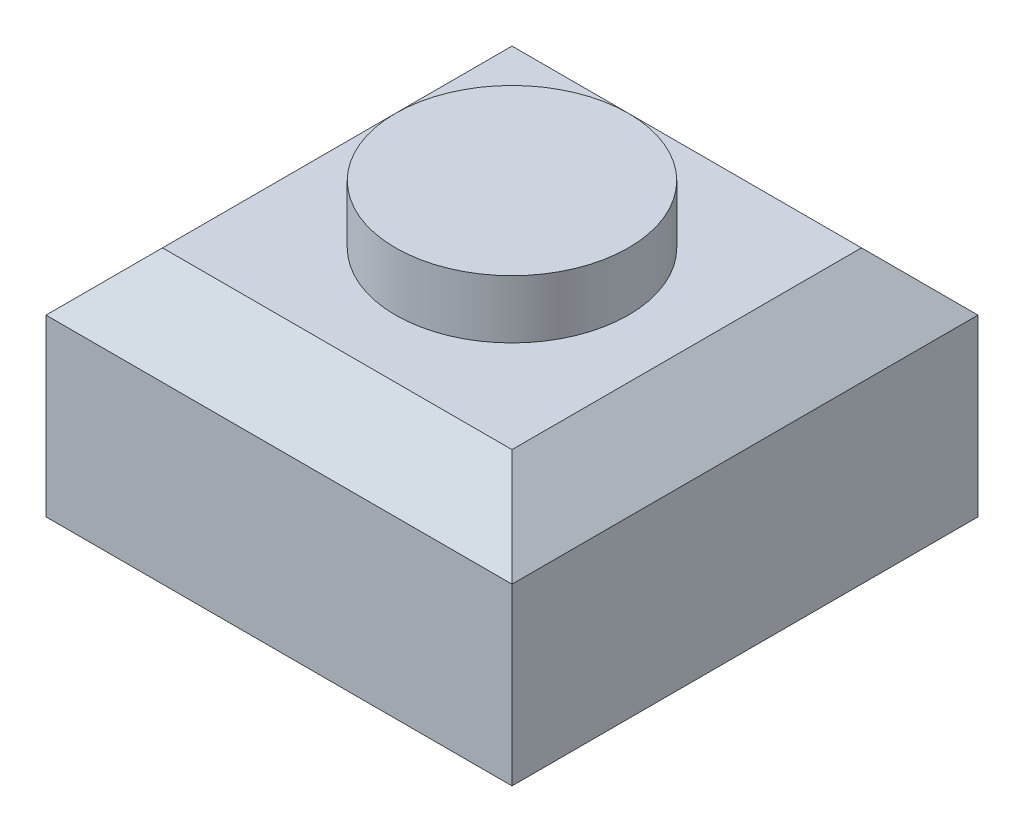
ISO-10303-21;
HEADER;
FILE_DESCRIPTION(('STEP AP214'),'2;1');
FILE_NAME('part.step','',(''),(''),'','','');
FILE_SCHEMA(('AUTOMOTIVE_DESIGN { 1 0 10303 214 1 1 1 1 }'));
ENDSEC;
DATA;
#1=APPLICATION_CONTEXT('core data for automotive mechanical design processes');
#2=APPLICATION_PROTOCOL_DEFINITION('international standard','automotive_design',2000,#1);
#3=PRODUCT_CONTEXT('',#1,'mechanical');
#4=PRODUCT('Part','Part','',(#3));
#5=PRODUCT_RELATED_PRODUCT_CATEGORY('part','',(#4));
#6=PRODUCT_DEFINITION_FORMATION('','',#4);
#7=PRODUCT_DEFINITION_CONTEXT('part definition',#1,'design');
#8=PRODUCT_DEFINITION('design','',#6,#7);
#9=PRODUCT_DEFINITION_SHAPE('','',#8);
#10=(LENGTH_UNIT() NAMED_UNIT(*) SI_UNIT(.MILLI.,.METRE.));
#11=(NAMED_UNIT(*) PLANE_ANGLE_UNIT() SI_UNIT($,.RADIAN.));
#12=(NAMED_UNIT(*) SI_UNIT($,.STERADIAN.) SOLID_ANGLE_UNIT());
#13=UNCERTAINTY_MEASURE_WITH_UNIT(LENGTH_MEASURE(1.E-05),#10,'distance_accuracy_value','');
#14=(GEOMETRIC_REPRESENTATION_CONTEXT(3) GLOBAL_UNCERTAINTY_ASSIGNED_CONTEXT((#13)) GLOBAL_UNIT_ASSIGNED_CONTEXT((#10,
#11,#12)) REPRESENTATION_CONTEXT('',''));
#15=CARTESIAN_POINT('',(0.,0.,0.));
#16=DIRECTION('',(0.,0.,1.));
#17=DIRECTION('',(1.,0.,0.));
#18=AXIS2_PLACEMENT_3D('',#15,#16,#17);
#19=CARTESIAN_POINT('',(-40.,40.,-40.));
#20=DIRECTION('',(1.,0.,0.));
#21=DIRECTION('',(0.,0.,-1.));
#22=AXIS2_PLACEMENT_3D('',#19,#20,#21);
#23=PLANE('',#22);
#24=DIRECTION('',(0.,-1.,0.));
#25=VECTOR('',#24,1.);
#26=CARTESIAN_POINT('',(-40.,40.,40.));
#27=LINE('',#26,#25);
#28=CARTESIAN_POINT('',(-40.,30.,40.));
#29=VERTEX_POINT('',#28);
#30=CARTESIAN_POINT('',(-40.,0.,40.));
#31=VERTEX_POINT('',#30);
#32=EDGE_CURVE('E92',#29,#31,#27,.T.);
#33=ORIENTED_EDGE('',*,*,#32,.F.);
#34=DIRECTION('',(0.,0.,-1.));
#35=VECTOR('',#34,1.);
#36=CARTESIAN_POINT('',(-40.,30.,-40.));
#37=LINE('',#36,#35);
#38=CARTESIAN_POINT('',(-40.,30.,-40.));
#39=VERTEX_POINT('',#38);
#40=EDGE_CURVE('E11',#29,#39,#37,.T.);
#41=ORIENTED_EDGE('',*,*,#40,.T.);
#42=DIRECTION('',(0.,-1.,0.));
#43=VECTOR('',#42,1.);
#44=CARTESIAN_POINT('',(-40.,40.,-40.));
#45=LINE('',#44,#43);
#46=CARTESIAN_POINT('',(-40.,0.,-40.));
#47=VERTEX_POINT('',#46);
#48=EDGE_CURVE('E112',#39,#47,#45,.T.);
#49=ORIENTED_EDGE('',*,*,#48,.T.);
#50=DIRECTION('',(0.,0.,1.));
#51=VECTOR('',#50,1.);
#52=CARTESIAN_POINT('',(-40.,0.,-40.));
#53=LINE('',#52,#51);
#54=EDGE_CURVE('E107',#47,#31,#53,.T.);
#55=ORIENTED_EDGE('',*,*,#54,.T.);
#56=EDGE_LOOP('',(#33,#41,#49,#55));
#57=FACE_BOUND('',#56,.T.);
#58=ADVANCED_FACE('F39',(#57),#23,.F.);
#59=CARTESIAN_POINT('',(-40.,40.,40.));
#60=DIRECTION('',(0.,0.,-1.));
#61=DIRECTION('',(-1.,0.,0.));
#62=AXIS2_PLACEMENT_3D('',#59,#60,#61);
#63=PLANE('',#62);
#64=DIRECTION('',(0.,-1.,0.));
#65=VECTOR('',#64,1.);
#66=CARTESIAN_POINT('',(40.,40.,40.));
#67=LINE('',#66,#65);
#68=CARTESIAN_POINT('',(40.,30.,40.));
#69=VERTEX_POINT('',#68);
#70=CARTESIAN_POINT('',(40.,0.,40.));
#71=VERTEX_POINT('',#70);
#72=EDGE_CURVE('E101',#69,#71,#67,.T.);
#73=ORIENTED_EDGE('',*,*,#72,.F.);
#74=DIRECTION('',(-1.,0.,0.));
#75=VECTOR('',#74,1.);
#76=CARTESIAN_POINT('',(-40.,30.,40.));
#77=LINE('',#76,#75);
#78=EDGE_CURVE('E49',#69,#29,#77,.T.);
#79=ORIENTED_EDGE('',*,*,#78,.T.);
#80=ORIENTED_EDGE('',*,*,#32,.T.);
#81=DIRECTION('',(1.,0.,0.));
#82=VECTOR('',#81,1.);
#83=CARTESIAN_POINT('',(-40.,0.,40.));
#84=LINE('',#83,#82);
#85=EDGE_CURVE('E95',#31,#71,#84,.T.);
#86=ORIENTED_EDGE('',*,*,#85,.T.);
#87=EDGE_LOOP('',(#73,#79,#80,#86));
#88=FACE_BOUND('',#87,.T.);
#89=ADVANCED_FACE('F94',(#88),#63,.F.);
#90=CARTESIAN_POINT('',(40.,40.,-40.));
#91=DIRECTION('',(-1.,0.,0.));
#92=DIRECTION('',(0.,0.,1.));
#93=AXIS2_PLACEMENT_3D('',#90,#91,#92);
#94=PLANE('',#93);
#95=DIRECTION('',(0.,-1.,0.));
#96=VECTOR('',#95,1.);
#97=CARTESIAN_POINT('',(40.,40.,-40.));
#98=LINE('',#97,#96);
#99=CARTESIAN_POINT('',(40.,30.,-40.));
#100=VERTEX_POINT('',#99);
#101=CARTESIAN_POINT('',(40.,0.,-40.));
#102=VERTEX_POINT('',#101);
#103=EDGE_CURVE('E124',#100,#102,#98,.T.);
#104=ORIENTED_EDGE('',*,*,#103,.F.);
#105=DIRECTION('',(0.,0.,1.));
#106=VECTOR('',#105,1.);
#107=CARTESIAN_POINT('',(40.,30.,40.));
#108=LINE('',#107,#106);
#109=EDGE_CURVE('E64',#100,#69,#108,.T.);
#110=ORIENTED_EDGE('',*,*,#109,.T.);
#111=ORIENTED_EDGE('',*,*,#72,.T.);
#112=DIRECTION('',(0.,0.,-1.));
#113=VECTOR('',#112,1.);
#114=CARTESIAN_POINT('',(40.,0.,-40.));
#115=LINE('',#114,#113);
#116=EDGE_CURVE('E109',#71,#102,#115,.T.);
#117=ORIENTED_EDGE('',*,*,#116,.T.);
#118=EDGE_LOOP('',(#104,#110,#111,#117));
#119=FACE_BOUND('',#118,.T.);
#120=ADVANCED_FACE('F191',(#119),#94,.F.);
#121=CARTESIAN_POINT('',(-40.,40.,-40.));
#122=DIRECTION('',(0.,0.,1.));
#123=DIRECTION('',(1.,0.,0.));
#124=AXIS2_PLACEMENT_3D('',#121,#122,#123);
#125=PLANE('',#124);
#126=ORIENTED_EDGE('',*,*,#48,.F.);
#127=DIRECTION('',(1.,0.,0.));
#128=VECTOR('',#127,1.);
#129=CARTESIAN_POINT('',(40.,30.,-40.));
#130=LINE('',#129,#128);
#131=EDGE_CURVE('E136',#39,#100,#130,.T.);
#132=ORIENTED_EDGE('',*,*,#131,.T.);
#133=ORIENTED_EDGE('',*,*,#103,.T.);
#134=DIRECTION('',(-1.,0.,0.));
#135=VECTOR('',#134,1.);
#136=CARTESIAN_POINT('',(-40.,0.,-40.));
#137=LINE('',#136,#135);
#138=EDGE_CURVE('E121',#102,#47,#137,.T.);
#139=ORIENTED_EDGE('',*,*,#138,.T.);
#140=EDGE_LOOP('',(#126,#132,#133,#139));
#141=FACE_BOUND('',#140,.T.);
#142=ADVANCED_FACE('F161',(#141),#125,.F.);
#143=CARTESIAN_POINT('',(0.,40.,0.));
#144=DIRECTION('',(0.,1.,0.));
#145=DIRECTION('',(0.,0.,1.));
#146=AXIS2_PLACEMENT_3D('',#143,#144,#145);
#147=PLANE('',#146);
#148=DIRECTION('',(0.,0.,-1.));
#149=VECTOR('',#148,1.);
#150=CARTESIAN_POINT('',(30.,40.,-40.));
#151=LINE('',#150,#149);
#152=CARTESIAN_POINT('',(30.,40.,30.));
#153=VERTEX_POINT('',#152);
#154=CARTESIAN_POINT('',(30.,40.,-30.));
#155=VERTEX_POINT('',#154);
#156=EDGE_CURVE('E131',#153,#155,#151,.T.);
#157=ORIENTED_EDGE('',*,*,#156,.T.);
#158=DIRECTION('',(-1.,0.,0.));
#159=VECTOR('',#158,1.);
#160=CARTESIAN_POINT('',(-40.,40.,-30.));
#161=LINE('',#160,#159);
#162=CARTESIAN_POINT('',(-30.,40.,-30.));
#163=VERTEX_POINT('',#162);
#164=EDGE_CURVE('E133',#155,#163,#161,.T.);
#165=ORIENTED_EDGE('',*,*,#164,.T.);
#166=DIRECTION('',(0.,0.,1.));
#167=VECTOR('',#166,1.);
#168=CARTESIAN_POINT('',(-30.,40.,40.));
#169=LINE('',#168,#167);
#170=CARTESIAN_POINT('',(-30.,40.,30.));
#171=VERTEX_POINT('',#170);
#172=EDGE_CURVE('E127',#163,#171,#169,.T.);
#173=ORIENTED_EDGE('',*,*,#172,.T.);
#174=DIRECTION('',(1.,0.,0.));
#175=VECTOR('',#174,1.);
#176=CARTESIAN_POINT('',(40.,40.,30.));
#177=LINE('',#176,#175);
#178=EDGE_CURVE('E129',#171,#153,#177,.T.);
#179=ORIENTED_EDGE('',*,*,#178,.T.);
#180=EDGE_LOOP('',(#157,#165,#173,#179));
#181=FACE_BOUND('',#180,.T.);
#182=CARTESIAN_POINT('',(0.,40.,0.));
#183=DIRECTION('',(0.,1.,0.));
#184=DIRECTION('',(0.,0.,1.));
#185=AXIS2_PLACEMENT_3D('',#182,#183,#184);
#186=CIRCLE('',#185,20.);
#187=CARTESIAN_POINT('',(0.,40.,20.));
#188=VERTEX_POINT('',#187);
#189=EDGE_CURVE('E100',#188,#188,#186,.T.);
#190=ORIENTED_EDGE('',*,*,#189,.F.);
#191=EDGE_LOOP('',(#190));
#192=FACE_BOUND('',#191,.T.);
#193=ADVANCED_FACE('F166',(#181,#192),#147,.T.);
#194=CARTESIAN_POINT('',(0.,0.,0.));
#195=DIRECTION('',(0.,1.,0.));
#196=DIRECTION('',(0.,0.,1.));
#197=AXIS2_PLACEMENT_3D('',#194,#195,#196);
#198=PLANE('',#197);
#199=ORIENTED_EDGE('',*,*,#54,.F.);
#200=ORIENTED_EDGE('',*,*,#138,.F.);
#201=ORIENTED_EDGE('',*,*,#116,.F.);
#202=ORIENTED_EDGE('',*,*,#85,.F.);
#203=EDGE_LOOP('',(#199,#200,#201,#202));
#204=FACE_BOUND('',#203,.T.);
#205=ADVANCED_FACE('F105',(#204),#198,.F.);
#206=CARTESIAN_POINT('',(0.,50.,0.));
#207=DIRECTION('',(0.,-1.,0.));
#208=DIRECTION('',(0.,0.,-1.));
#209=AXIS2_PLACEMENT_3D('',#206,#207,#208);
#210=CYLINDRICAL_SURFACE('',#209,20.);
#211=CARTESIAN_POINT('',(0.,50.,0.));
#212=DIRECTION('',(0.,1.,0.));
#213=DIRECTION('',(0.,0.,1.));
#214=AXIS2_PLACEMENT_3D('',#211,#212,#213);
#215=CIRCLE('',#214,20.);
#216=CARTESIAN_POINT('',(0.,50.,20.));
#217=VERTEX_POINT('',#216);
#218=EDGE_CURVE('E114',#217,#217,#215,.T.);
#219=ORIENTED_EDGE('',*,*,#218,.F.);
#220=EDGE_LOOP('',(#219));
#221=FACE_BOUND('',#220,.T.);
#222=ORIENTED_EDGE('',*,*,#189,.T.);
#223=EDGE_LOOP('',(#222));
#224=FACE_BOUND('',#223,.T.);
#225=ADVANCED_FACE('F173',(#221,#224),#210,.T.);
#226=CARTESIAN_POINT('',(0.,50.,0.));
#227=DIRECTION('',(0.,1.,0.));
#228=DIRECTION('',(0.,0.,1.));
#229=AXIS2_PLACEMENT_3D('',#226,#227,#228);
#230=PLANE('',#229);
#231=ORIENTED_EDGE('',*,*,#218,.T.);
#232=EDGE_LOOP('',(#231));
#233=FACE_BOUND('',#232,.T.);
#234=ADVANCED_FACE('F175',(#233),#230,.T.);
#235=CARTESIAN_POINT('',(0.,40.,30.));
#236=DIRECTION('',(0.,0.707106781186546,0.707106781186549));
#237=DIRECTION('',(-1.,0.,0.));
#238=AXIS2_PLACEMENT_3D('',#235,#236,#237);
#239=PLANE('',#238);
#240=DIRECTION('',(0.577350269189625,0.577350269189627,-0.577350269189625));
#241=VECTOR('',#240,1.);
#242=CARTESIAN_POINT('',(-20.,50.,20.));
#243=LINE('',#242,#241);
#244=EDGE_CURVE('E144',#29,#171,#243,.T.);
#245=ORIENTED_EDGE('',*,*,#244,.F.);
#246=ORIENTED_EDGE('',*,*,#78,.F.);
#247=DIRECTION('',(-0.577350269189625,0.577350269189627,-0.577350269189625));
#248=VECTOR('',#247,1.);
#249=CARTESIAN_POINT('',(20.,50.,20.));
#250=LINE('',#249,#248);
#251=EDGE_CURVE('E44',#153,#69,#250,.F.);
#252=ORIENTED_EDGE('',*,*,#251,.F.);
#253=ORIENTED_EDGE('',*,*,#178,.F.);
#254=EDGE_LOOP('',(#245,#246,#252,#253));
#255=FACE_BOUND('',#254,.T.);
#256=ADVANCED_FACE('F42',(#255),#239,.T.);
#257=CARTESIAN_POINT('',(30.,40.,0.));
#258=DIRECTION('',(0.707106781186549,0.707106781186546,0.));
#259=DIRECTION('',(0.,0.,1.));
#260=AXIS2_PLACEMENT_3D('',#257,#258,#259);
#261=PLANE('',#260);
#262=ORIENTED_EDGE('',*,*,#251,.T.);
#263=ORIENTED_EDGE('',*,*,#109,.F.);
#264=DIRECTION('',(-0.577350269189625,0.577350269189627,0.577350269189625));
#265=VECTOR('',#264,1.);
#266=CARTESIAN_POINT('',(20.,50.,-20.));
#267=LINE('',#266,#265);
#268=EDGE_CURVE('E143',#155,#100,#267,.F.);
#269=ORIENTED_EDGE('',*,*,#268,.F.);
#270=ORIENTED_EDGE('',*,*,#156,.F.);
#271=EDGE_LOOP('',(#262,#263,#269,#270));
#272=FACE_BOUND('',#271,.T.);
#273=ADVANCED_FACE('F153',(#272),#261,.T.);
#274=CARTESIAN_POINT('',(-30.,40.,0.));
#275=DIRECTION('',(-0.707106781186549,0.707106781186546,0.));
#276=DIRECTION('',(0.,0.,-1.));
#277=AXIS2_PLACEMENT_3D('',#274,#275,#276);
#278=PLANE('',#277);
#279=ORIENTED_EDGE('',*,*,#244,.T.);
#280=ORIENTED_EDGE('',*,*,#172,.F.);
#281=DIRECTION('',(-0.577350269189625,-0.577350269189627,-0.577350269189625));
#282=VECTOR('',#281,1.);
#283=CARTESIAN_POINT('',(-20.,50.,-20.));
#284=LINE('',#283,#282);
#285=EDGE_CURVE('E141',#39,#163,#284,.F.);
#286=ORIENTED_EDGE('',*,*,#285,.F.);
#287=ORIENTED_EDGE('',*,*,#40,.F.);
#288=EDGE_LOOP('',(#279,#280,#286,#287));
#289=FACE_BOUND('',#288,.T.);
#290=ADVANCED_FACE('F158',(#289),#278,.T.);
#291=CARTESIAN_POINT('',(0.,40.,-30.));
#292=DIRECTION('',(0.,0.707106781186546,-0.707106781186549));
#293=DIRECTION('',(1.,0.,0.));
#294=AXIS2_PLACEMENT_3D('',#291,#292,#293);
#295=PLANE('',#294);
#296=ORIENTED_EDGE('',*,*,#268,.T.);
#297=ORIENTED_EDGE('',*,*,#131,.F.);
#298=ORIENTED_EDGE('',*,*,#285,.T.);
#299=ORIENTED_EDGE('',*,*,#164,.F.);
#300=EDGE_LOOP('',(#296,#297,#298,#299));
#301=FACE_BOUND('',#300,.T.);
#302=ADVANCED_FACE('F163',(#301),#295,.T.);
#303=CLOSED_SHELL('',(#58,#89,#120,#142,#193,#205,#225,#234,#256,#273,#290,#302));
#304=MANIFOLD_SOLID_BREP('B2',#303);
#305=ADVANCED_BREP_SHAPE_REPRESENTATION('',(#18,#304),#14);
#306=SHAPE_DEFINITION_REPRESENTATION(#9,#305);
ENDSEC;
END-ISO-10303-21;
